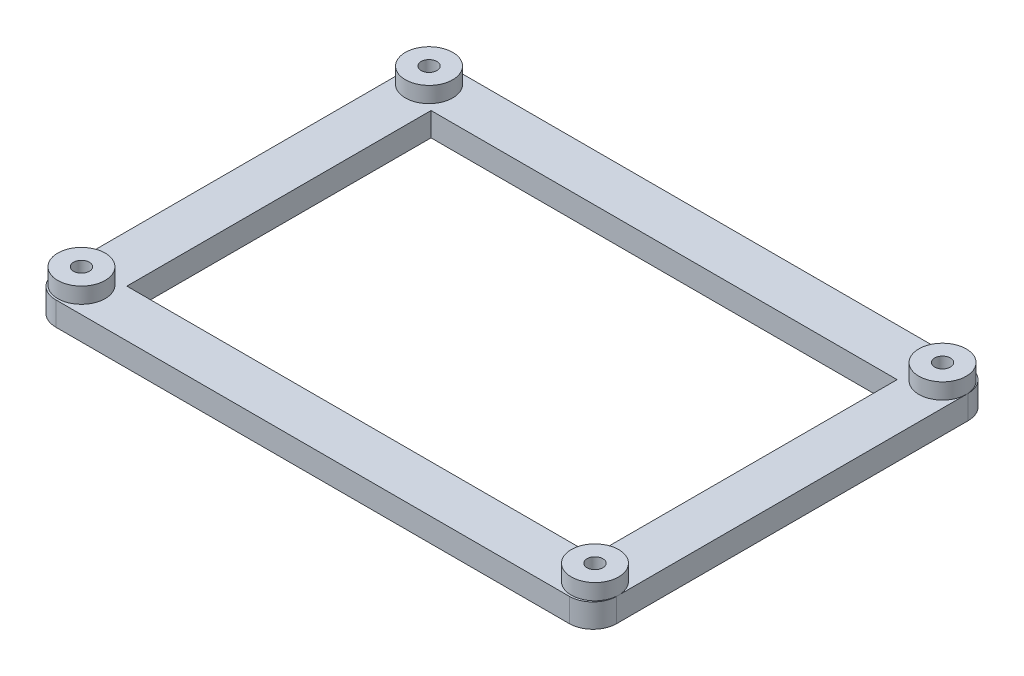
ISO-10303-21;
HEADER;
FILE_DESCRIPTION(('STEP AP214'),'2;1');
FILE_NAME('part.step','',(''),(''),'','','');
FILE_SCHEMA(('AUTOMOTIVE_DESIGN { 1 0 10303 214 1 1 1 1 }'));
ENDSEC;
DATA;
#1=APPLICATION_CONTEXT('core data for automotive mechanical design processes');
#2=APPLICATION_PROTOCOL_DEFINITION('international standard','automotive_design',2000,#1);
#3=PRODUCT_CONTEXT('',#1,'mechanical');
#4=PRODUCT('Part','Part','',(#3));
#5=PRODUCT_RELATED_PRODUCT_CATEGORY('part','',(#4));
#6=PRODUCT_DEFINITION_FORMATION('','',#4);
#7=PRODUCT_DEFINITION_CONTEXT('part definition',#1,'design');
#8=PRODUCT_DEFINITION('design','',#6,#7);
#9=PRODUCT_DEFINITION_SHAPE('','',#8);
#10=(LENGTH_UNIT() NAMED_UNIT(*) SI_UNIT(.MILLI.,.METRE.));
#11=(NAMED_UNIT(*) PLANE_ANGLE_UNIT() SI_UNIT($,.RADIAN.));
#12=(NAMED_UNIT(*) SI_UNIT($,.STERADIAN.) SOLID_ANGLE_UNIT());
#13=UNCERTAINTY_MEASURE_WITH_UNIT(LENGTH_MEASURE(1.E-05),#10,'distance_accuracy_value','');
#14=(GEOMETRIC_REPRESENTATION_CONTEXT(3) GLOBAL_UNCERTAINTY_ASSIGNED_CONTEXT((#13)) GLOBAL_UNIT_ASSIGNED_CONTEXT((#10,
#11,#12)) REPRESENTATION_CONTEXT('',''));
#15=CARTESIAN_POINT('',(0.,0.,0.));
#16=DIRECTION('',(0.,0.,1.));
#17=DIRECTION('',(1.,0.,0.));
#18=AXIS2_PLACEMENT_3D('',#15,#16,#17);
#19=CARTESIAN_POINT('',(0.,3.,0.));
#20=DIRECTION('',(0.,-1.,0.));
#21=DIRECTION('',(0.,0.,-1.));
#22=AXIS2_PLACEMENT_3D('',#19,#20,#21);
#23=PLANE('',#22);
#24=DIRECTION('',(1.,0.,0.));
#25=VECTOR('',#24,1.);
#26=CARTESIAN_POINT('',(-29.5,3.,19.25));
#27=LINE('',#26,#25);
#28=CARTESIAN_POINT('',(-29.5,3.,19.25));
#29=VERTEX_POINT('',#28);
#30=CARTESIAN_POINT('',(29.5,3.,19.25));
#31=VERTEX_POINT('',#30);
#32=EDGE_CURVE('E516',#29,#31,#27,.T.);
#33=ORIENTED_EDGE('',*,*,#32,.F.);
#34=DIRECTION('',(0.,0.,1.));
#35=VECTOR('',#34,1.);
#36=CARTESIAN_POINT('',(-29.5,3.,19.25));
#37=LINE('',#36,#35);
#38=CARTESIAN_POINT('',(-29.5,3.,-19.25));
#39=VERTEX_POINT('',#38);
#40=EDGE_CURVE('E510',#39,#29,#37,.T.);
#41=ORIENTED_EDGE('',*,*,#40,.F.);
#42=DIRECTION('',(-1.,0.,0.));
#43=VECTOR('',#42,1.);
#44=CARTESIAN_POINT('',(-29.5,3.,-19.25));
#45=LINE('',#44,#43);
#46=CARTESIAN_POINT('',(29.5,3.,-19.25));
#47=VERTEX_POINT('',#46);
#48=EDGE_CURVE('E531',#47,#39,#45,.T.);
#49=ORIENTED_EDGE('',*,*,#48,.F.);
#50=DIRECTION('',(0.,0.,-1.));
#51=VECTOR('',#50,1.);
#52=CARTESIAN_POINT('',(29.5,3.,19.25));
#53=LINE('',#52,#51);
#54=EDGE_CURVE('E518',#31,#47,#53,.T.);
#55=ORIENTED_EDGE('',*,*,#54,.F.);
#56=EDGE_LOOP('',(#33,#41,#49,#55));
#57=FACE_BOUND('',#56,.T.);
#58=DIRECTION('',(0.,0.,-1.));
#59=VECTOR('',#58,1.);
#60=CARTESIAN_POINT('',(35.5,3.,25.25));
#61=LINE('',#60,#59);
#62=CARTESIAN_POINT('',(35.5,3.,-22.));
#63=VERTEX_POINT('',#62);
#64=CARTESIAN_POINT('',(35.5,3.,-22.25));
#65=VERTEX_POINT('',#64);
#66=EDGE_CURVE('E175',#63,#65,#61,.T.);
#67=ORIENTED_EDGE('',*,*,#66,.T.);
#68=CARTESIAN_POINT('',(32.5,3.,-22.25));
#69=DIRECTION('',(0.,-1.,0.));
#70=DIRECTION('',(0.,0.,-1.));
#71=AXIS2_PLACEMENT_3D('',#68,#69,#70);
#72=CIRCLE('',#71,3.);
#73=CARTESIAN_POINT('',(32.5,3.,-25.25));
#74=VERTEX_POINT('',#73);
#75=EDGE_CURVE('E197',#65,#74,#72,.F.);
#76=ORIENTED_EDGE('',*,*,#75,.T.);
#77=DIRECTION('',(-1.,0.,0.));
#78=VECTOR('',#77,1.);
#79=CARTESIAN_POINT('',(-35.5,3.,-25.25));
#80=LINE('',#79,#78);
#81=CARTESIAN_POINT('',(-32.5,3.,-25.25));
#82=VERTEX_POINT('',#81);
#83=EDGE_CURVE('E157',#74,#82,#80,.T.);
#84=ORIENTED_EDGE('',*,*,#83,.T.);
#85=CARTESIAN_POINT('',(-32.5,3.,-22.25));
#86=DIRECTION('',(0.,-1.,0.));
#87=DIRECTION('',(0.,0.,-1.));
#88=AXIS2_PLACEMENT_3D('',#85,#86,#87);
#89=CIRCLE('',#88,3.);
#90=CARTESIAN_POINT('',(-35.5,3.,-22.25));
#91=VERTEX_POINT('',#90);
#92=EDGE_CURVE('E146',#82,#91,#89,.F.);
#93=ORIENTED_EDGE('',*,*,#92,.T.);
#94=DIRECTION('',(0.,0.,1.));
#95=VECTOR('',#94,1.);
#96=CARTESIAN_POINT('',(-35.5,3.,25.25));
#97=LINE('',#96,#95);
#98=CARTESIAN_POINT('',(-35.5,3.,-22.));
#99=VERTEX_POINT('',#98);
#100=EDGE_CURVE('E139',#91,#99,#97,.T.);
#101=ORIENTED_EDGE('',*,*,#100,.T.);
#102=CARTESIAN_POINT('',(-32.5,3.,-22.));
#103=DIRECTION('',(0.,1.,0.));
#104=DIRECTION('',(0.,0.,1.));
#105=AXIS2_PLACEMENT_3D('',#102,#103,#104);
#106=CIRCLE('',#105,3.);
#107=EDGE_CURVE('E143',#99,#99,#106,.T.);
#108=ORIENTED_EDGE('',*,*,#107,.F.);
#109=CARTESIAN_POINT('',(-35.5,3.,22.));
#110=VERTEX_POINT('',#109);
#111=EDGE_CURVE('E151',#99,#110,#97,.T.);
#112=ORIENTED_EDGE('',*,*,#111,.T.);
#113=CARTESIAN_POINT('',(-32.5,3.,22.));
#114=DIRECTION('',(0.,1.,0.));
#115=DIRECTION('',(0.,0.,1.));
#116=AXIS2_PLACEMENT_3D('',#113,#114,#115);
#117=CIRCLE('',#116,3.);
#118=EDGE_CURVE('E564',#110,#110,#117,.T.);
#119=ORIENTED_EDGE('',*,*,#118,.F.);
#120=CARTESIAN_POINT('',(-35.5,3.,22.25));
#121=VERTEX_POINT('',#120);
#122=EDGE_CURVE('E153',#110,#121,#97,.T.);
#123=ORIENTED_EDGE('',*,*,#122,.T.);
#124=CARTESIAN_POINT('',(-32.5,3.,22.25));
#125=DIRECTION('',(0.,-1.,0.));
#126=DIRECTION('',(0.,0.,-1.));
#127=AXIS2_PLACEMENT_3D('',#124,#125,#126);
#128=CIRCLE('',#127,3.);
#129=CARTESIAN_POINT('',(-32.5,3.,25.25));
#130=VERTEX_POINT('',#129);
#131=EDGE_CURVE('E59',#121,#130,#128,.F.);
#132=ORIENTED_EDGE('',*,*,#131,.T.);
#133=DIRECTION('',(1.,0.,0.));
#134=VECTOR('',#133,1.);
#135=CARTESIAN_POINT('',(-35.5,3.,25.25));
#136=LINE('',#135,#134);
#137=CARTESIAN_POINT('',(32.5,3.,25.25));
#138=VERTEX_POINT('',#137);
#139=EDGE_CURVE('E150',#130,#138,#136,.T.);
#140=ORIENTED_EDGE('',*,*,#139,.T.);
#141=CARTESIAN_POINT('',(32.5,3.,22.25));
#142=DIRECTION('',(0.,-1.,0.));
#143=DIRECTION('',(0.,0.,-1.));
#144=AXIS2_PLACEMENT_3D('',#141,#142,#143);
#145=CIRCLE('',#144,3.);
#146=CARTESIAN_POINT('',(35.5,3.,22.25));
#147=VERTEX_POINT('',#146);
#148=EDGE_CURVE('E194',#138,#147,#145,.F.);
#149=ORIENTED_EDGE('',*,*,#148,.T.);
#150=CARTESIAN_POINT('',(35.5,3.,22.));
#151=VERTEX_POINT('',#150);
#152=EDGE_CURVE('E222',#147,#151,#61,.T.);
#153=ORIENTED_EDGE('',*,*,#152,.T.);
#154=CARTESIAN_POINT('',(32.5,3.,22.));
#155=DIRECTION('',(0.,1.,0.));
#156=DIRECTION('',(0.,0.,1.));
#157=AXIS2_PLACEMENT_3D('',#154,#155,#156);
#158=CIRCLE('',#157,3.);
#159=EDGE_CURVE('E555',#151,#151,#158,.T.);
#160=ORIENTED_EDGE('',*,*,#159,.F.);
#161=EDGE_CURVE('E224',#151,#63,#61,.T.);
#162=ORIENTED_EDGE('',*,*,#161,.T.);
#163=CARTESIAN_POINT('',(32.5,3.,-22.));
#164=DIRECTION('',(0.,1.,0.));
#165=DIRECTION('',(0.,0.,1.));
#166=AXIS2_PLACEMENT_3D('',#163,#164,#165);
#167=CIRCLE('',#166,3.);
#168=EDGE_CURVE('E231',#63,#63,#167,.T.);
#169=ORIENTED_EDGE('',*,*,#168,.F.);
#170=EDGE_LOOP('',(#67,#76,#84,#93,#101,#108,#112,#119,#123,#132,#140,#149,#153,#160,#162,#169));
#171=FACE_BOUND('',#170,.T.);
#172=ADVANCED_FACE('F39',(#57,#171),#23,.F.);
#173=CARTESIAN_POINT('',(0.,0.,0.));
#174=DIRECTION('',(0.,-1.,0.));
#175=DIRECTION('',(0.,0.,-1.));
#176=AXIS2_PLACEMENT_3D('',#173,#174,#175);
#177=PLANE('',#176);
#178=CARTESIAN_POINT('',(32.5,0.,22.));
#179=DIRECTION('',(0.,1.,0.));
#180=DIRECTION('',(0.,0.,1.));
#181=AXIS2_PLACEMENT_3D('',#178,#179,#180);
#182=CIRCLE('',#181,0.999999999999998);
#183=CARTESIAN_POINT('',(32.5,0.,23.));
#184=VERTEX_POINT('',#183);
#185=EDGE_CURVE('E539',#184,#184,#182,.T.);
#186=ORIENTED_EDGE('',*,*,#185,.T.);
#187=EDGE_LOOP('',(#186));
#188=FACE_BOUND('',#187,.T.);
#189=CARTESIAN_POINT('',(-32.5,0.,-22.));
#190=DIRECTION('',(0.,1.,0.));
#191=DIRECTION('',(0.,0.,1.));
#192=AXIS2_PLACEMENT_3D('',#189,#190,#191);
#193=CIRCLE('',#192,0.999999999999998);
#194=CARTESIAN_POINT('',(-32.5,0.,-21.));
#195=VERTEX_POINT('',#194);
#196=EDGE_CURVE('E504',#195,#195,#193,.T.);
#197=ORIENTED_EDGE('',*,*,#196,.T.);
#198=EDGE_LOOP('',(#197));
#199=FACE_BOUND('',#198,.T.);
#200=DIRECTION('',(-1.,0.,0.));
#201=VECTOR('',#200,1.);
#202=CARTESIAN_POINT('',(-35.5,0.,-25.25));
#203=LINE('',#202,#201);
#204=CARTESIAN_POINT('',(32.5,0.,-25.25));
#205=VERTEX_POINT('',#204);
#206=CARTESIAN_POINT('',(-32.5,0.,-25.25));
#207=VERTEX_POINT('',#206);
#208=EDGE_CURVE('E166',#205,#207,#203,.T.);
#209=ORIENTED_EDGE('',*,*,#208,.F.);
#210=CARTESIAN_POINT('',(32.5,0.,-22.25));
#211=DIRECTION('',(0.,-1.,0.));
#212=DIRECTION('',(0.,0.,-1.));
#213=AXIS2_PLACEMENT_3D('',#210,#211,#212);
#214=CIRCLE('',#213,3.);
#215=CARTESIAN_POINT('',(35.5,0.,-22.25));
#216=VERTEX_POINT('',#215);
#217=EDGE_CURVE('E186',#205,#216,#214,.T.);
#218=ORIENTED_EDGE('',*,*,#217,.T.);
#219=DIRECTION('',(0.,0.,-1.));
#220=VECTOR('',#219,1.);
#221=CARTESIAN_POINT('',(35.5,0.,25.25));
#222=LINE('',#221,#220);
#223=CARTESIAN_POINT('',(35.5,0.,22.25));
#224=VERTEX_POINT('',#223);
#225=EDGE_CURVE('E163',#224,#216,#222,.T.);
#226=ORIENTED_EDGE('',*,*,#225,.F.);
#227=CARTESIAN_POINT('',(32.5,0.,22.25));
#228=DIRECTION('',(0.,-1.,0.));
#229=DIRECTION('',(0.,0.,-1.));
#230=AXIS2_PLACEMENT_3D('',#227,#228,#229);
#231=CIRCLE('',#230,3.);
#232=CARTESIAN_POINT('',(32.5,0.,25.25));
#233=VERTEX_POINT('',#232);
#234=EDGE_CURVE('E182',#224,#233,#231,.T.);
#235=ORIENTED_EDGE('',*,*,#234,.T.);
#236=DIRECTION('',(1.,0.,0.));
#237=VECTOR('',#236,1.);
#238=CARTESIAN_POINT('',(-35.5,0.,25.25));
#239=LINE('',#238,#237);
#240=CARTESIAN_POINT('',(-32.5,0.,25.25));
#241=VERTEX_POINT('',#240);
#242=EDGE_CURVE('E173',#241,#233,#239,.T.);
#243=ORIENTED_EDGE('',*,*,#242,.F.);
#244=CARTESIAN_POINT('',(-32.5,0.,22.25));
#245=DIRECTION('',(0.,-1.,0.));
#246=DIRECTION('',(0.,0.,-1.));
#247=AXIS2_PLACEMENT_3D('',#244,#245,#246);
#248=CIRCLE('',#247,3.);
#249=CARTESIAN_POINT('',(-35.5,0.,22.25));
#250=VERTEX_POINT('',#249);
#251=EDGE_CURVE('E180',#241,#250,#248,.T.);
#252=ORIENTED_EDGE('',*,*,#251,.T.);
#253=DIRECTION('',(0.,0.,1.));
#254=VECTOR('',#253,1.);
#255=CARTESIAN_POINT('',(-35.5,0.,25.25));
#256=LINE('',#255,#254);
#257=CARTESIAN_POINT('',(-35.5,0.,-22.25));
#258=VERTEX_POINT('',#257);
#259=EDGE_CURVE('E170',#258,#250,#256,.T.);
#260=ORIENTED_EDGE('',*,*,#259,.F.);
#261=CARTESIAN_POINT('',(-32.5,0.,-22.25));
#262=DIRECTION('',(0.,-1.,0.));
#263=DIRECTION('',(0.,0.,-1.));
#264=AXIS2_PLACEMENT_3D('',#261,#262,#263);
#265=CIRCLE('',#264,3.);
#266=EDGE_CURVE('E184',#258,#207,#265,.T.);
#267=ORIENTED_EDGE('',*,*,#266,.T.);
#268=EDGE_LOOP('',(#209,#218,#226,#235,#243,#252,#260,#267));
#269=FACE_BOUND('',#268,.T.);
#270=DIRECTION('',(0.,0.,1.));
#271=VECTOR('',#270,1.);
#272=CARTESIAN_POINT('',(-29.5,0.,19.25));
#273=LINE('',#272,#271);
#274=CARTESIAN_POINT('',(-29.5,0.,-19.25));
#275=VERTEX_POINT('',#274);
#276=CARTESIAN_POINT('',(-29.5,0.,19.25));
#277=VERTEX_POINT('',#276);
#278=EDGE_CURVE('E507',#275,#277,#273,.T.);
#279=ORIENTED_EDGE('',*,*,#278,.T.);
#280=DIRECTION('',(1.,0.,0.));
#281=VECTOR('',#280,1.);
#282=CARTESIAN_POINT('',(-29.5,0.,19.25));
#283=LINE('',#282,#281);
#284=CARTESIAN_POINT('',(29.5,0.,19.25));
#285=VERTEX_POINT('',#284);
#286=EDGE_CURVE('E497',#277,#285,#283,.T.);
#287=ORIENTED_EDGE('',*,*,#286,.T.);
#288=DIRECTION('',(0.,0.,-1.));
#289=VECTOR('',#288,1.);
#290=CARTESIAN_POINT('',(29.5,0.,19.25));
#291=LINE('',#290,#289);
#292=CARTESIAN_POINT('',(29.5,0.,-19.25));
#293=VERTEX_POINT('',#292);
#294=EDGE_CURVE('E503',#285,#293,#291,.T.);
#295=ORIENTED_EDGE('',*,*,#294,.T.);
#296=DIRECTION('',(-1.,0.,0.));
#297=VECTOR('',#296,1.);
#298=CARTESIAN_POINT('',(-29.5,0.,-19.25));
#299=LINE('',#298,#297);
#300=EDGE_CURVE('E515',#293,#275,#299,.T.);
#301=ORIENTED_EDGE('',*,*,#300,.T.);
#302=EDGE_LOOP('',(#279,#287,#295,#301));
#303=FACE_BOUND('',#302,.T.);
#304=CARTESIAN_POINT('',(-32.5,0.,22.));
#305=DIRECTION('',(0.,1.,0.));
#306=DIRECTION('',(0.,0.,1.));
#307=AXIS2_PLACEMENT_3D('',#304,#305,#306);
#308=CIRCLE('',#307,0.999999999999998);
#309=CARTESIAN_POINT('',(-32.5,0.,23.));
#310=VERTEX_POINT('',#309);
#311=EDGE_CURVE('E536',#310,#310,#308,.T.);
#312=ORIENTED_EDGE('',*,*,#311,.T.);
#313=EDGE_LOOP('',(#312));
#314=FACE_BOUND('',#313,.T.);
#315=CARTESIAN_POINT('',(32.5,0.,-22.));
#316=DIRECTION('',(0.,1.,0.));
#317=DIRECTION('',(0.,0.,1.));
#318=AXIS2_PLACEMENT_3D('',#315,#316,#317);
#319=CIRCLE('',#318,0.999999999999998);
#320=CARTESIAN_POINT('',(32.5,0.,-21.));
#321=VERTEX_POINT('',#320);
#322=EDGE_CURVE('E542',#321,#321,#319,.T.);
#323=ORIENTED_EDGE('',*,*,#322,.T.);
#324=EDGE_LOOP('',(#323));
#325=FACE_BOUND('',#324,.T.);
#326=ADVANCED_FACE('F209',(#188,#199,#269,#303,#314,#325),#177,.T.);
#327=CARTESIAN_POINT('',(35.5,3.,25.25));
#328=DIRECTION('',(-1.,0.,0.));
#329=DIRECTION('',(0.,0.,1.));
#330=AXIS2_PLACEMENT_3D('',#327,#328,#329);
#331=PLANE('',#330);
#332=ORIENTED_EDGE('',*,*,#225,.T.);
#333=DIRECTION('',(0.,-1.,0.));
#334=VECTOR('',#333,1.);
#335=CARTESIAN_POINT('',(35.5,3.,-22.25));
#336=LINE('',#335,#334);
#337=EDGE_CURVE('E191',#216,#65,#336,.F.);
#338=ORIENTED_EDGE('',*,*,#337,.T.);
#339=ORIENTED_EDGE('',*,*,#66,.F.);
#340=ORIENTED_EDGE('',*,*,#161,.F.);
#341=ORIENTED_EDGE('',*,*,#152,.F.);
#342=DIRECTION('',(0.,-1.,0.));
#343=VECTOR('',#342,1.);
#344=CARTESIAN_POINT('',(35.5,3.,22.25));
#345=LINE('',#344,#343);
#346=EDGE_CURVE('E188',#147,#224,#345,.T.);
#347=ORIENTED_EDGE('',*,*,#346,.T.);
#348=EDGE_LOOP('',(#332,#338,#339,#340,#341,#347));
#349=FACE_BOUND('',#348,.T.);
#350=ADVANCED_FACE('F219',(#349),#331,.F.);
#351=CARTESIAN_POINT('',(-35.5,3.,-25.25));
#352=DIRECTION('',(0.,0.,1.));
#353=DIRECTION('',(1.,0.,0.));
#354=AXIS2_PLACEMENT_3D('',#351,#352,#353);
#355=PLANE('',#354);
#356=ORIENTED_EDGE('',*,*,#83,.F.);
#357=DIRECTION('',(0.,-1.,0.));
#358=VECTOR('',#357,1.);
#359=CARTESIAN_POINT('',(32.5,3.,-25.25));
#360=LINE('',#359,#358);
#361=EDGE_CURVE('E177',#74,#205,#360,.T.);
#362=ORIENTED_EDGE('',*,*,#361,.T.);
#363=ORIENTED_EDGE('',*,*,#208,.T.);
#364=DIRECTION('',(0.,-1.,0.));
#365=VECTOR('',#364,1.);
#366=CARTESIAN_POINT('',(-32.5,3.,-25.25));
#367=LINE('',#366,#365);
#368=EDGE_CURVE('E162',#207,#82,#367,.F.);
#369=ORIENTED_EDGE('',*,*,#368,.T.);
#370=EDGE_LOOP('',(#356,#362,#363,#369));
#371=FACE_BOUND('',#370,.T.);
#372=ADVANCED_FACE('F236',(#371),#355,.F.);
#373=CARTESIAN_POINT('',(-35.5,3.,25.25));
#374=DIRECTION('',(1.,0.,0.));
#375=DIRECTION('',(0.,0.,-1.));
#376=AXIS2_PLACEMENT_3D('',#373,#374,#375);
#377=PLANE('',#376);
#378=ORIENTED_EDGE('',*,*,#100,.F.);
#379=DIRECTION('',(0.,-1.,0.));
#380=VECTOR('',#379,1.);
#381=CARTESIAN_POINT('',(-35.5,3.,-22.25));
#382=LINE('',#381,#380);
#383=EDGE_CURVE('E201',#91,#258,#382,.T.);
#384=ORIENTED_EDGE('',*,*,#383,.T.);
#385=ORIENTED_EDGE('',*,*,#259,.T.);
#386=DIRECTION('',(0.,-1.,0.));
#387=VECTOR('',#386,1.);
#388=CARTESIAN_POINT('',(-35.5,3.,22.25));
#389=LINE('',#388,#387);
#390=EDGE_CURVE('E199',#250,#121,#389,.F.);
#391=ORIENTED_EDGE('',*,*,#390,.T.);
#392=ORIENTED_EDGE('',*,*,#122,.F.);
#393=ORIENTED_EDGE('',*,*,#111,.F.);
#394=EDGE_LOOP('',(#378,#384,#385,#391,#392,#393));
#395=FACE_BOUND('',#394,.T.);
#396=ADVANCED_FACE('F155',(#395),#377,.F.);
#397=CARTESIAN_POINT('',(-35.5,3.,25.25));
#398=DIRECTION('',(0.,0.,-1.));
#399=DIRECTION('',(-1.,0.,0.));
#400=AXIS2_PLACEMENT_3D('',#397,#398,#399);
#401=PLANE('',#400);
#402=ORIENTED_EDGE('',*,*,#242,.T.);
#403=DIRECTION('',(0.,-1.,0.));
#404=VECTOR('',#403,1.);
#405=CARTESIAN_POINT('',(32.5,3.,25.25));
#406=LINE('',#405,#404);
#407=EDGE_CURVE('E11',#233,#138,#406,.F.);
#408=ORIENTED_EDGE('',*,*,#407,.T.);
#409=ORIENTED_EDGE('',*,*,#139,.F.);
#410=DIRECTION('',(0.,-1.,0.));
#411=VECTOR('',#410,1.);
#412=CARTESIAN_POINT('',(-32.5,3.,25.25));
#413=LINE('',#412,#411);
#414=EDGE_CURVE('E47',#130,#241,#413,.T.);
#415=ORIENTED_EDGE('',*,*,#414,.T.);
#416=EDGE_LOOP('',(#402,#408,#409,#415));
#417=FACE_BOUND('',#416,.T.);
#418=ADVANCED_FACE('F205',(#417),#401,.F.);
#419=CARTESIAN_POINT('',(-29.5,3.,19.25));
#420=DIRECTION('',(0.,0.,-1.));
#421=DIRECTION('',(-1.,0.,0.));
#422=AXIS2_PLACEMENT_3D('',#419,#420,#421);
#423=PLANE('',#422);
#424=ORIENTED_EDGE('',*,*,#286,.F.);
#425=DIRECTION('',(0.,-1.,0.));
#426=VECTOR('',#425,1.);
#427=CARTESIAN_POINT('',(-29.5,3.,19.25));
#428=LINE('',#427,#426);
#429=EDGE_CURVE('E499',#29,#277,#428,.T.);
#430=ORIENTED_EDGE('',*,*,#429,.F.);
#431=ORIENTED_EDGE('',*,*,#32,.T.);
#432=DIRECTION('',(0.,-1.,0.));
#433=VECTOR('',#432,1.);
#434=CARTESIAN_POINT('',(29.5,3.,19.25));
#435=LINE('',#434,#433);
#436=EDGE_CURVE('E167',#31,#285,#435,.T.);
#437=ORIENTED_EDGE('',*,*,#436,.T.);
#438=EDGE_LOOP('',(#424,#430,#431,#437));
#439=FACE_BOUND('',#438,.T.);
#440=ADVANCED_FACE('F256',(#439),#423,.T.);
#441=CARTESIAN_POINT('',(29.5,3.,19.25));
#442=DIRECTION('',(-1.,0.,0.));
#443=DIRECTION('',(0.,0.,1.));
#444=AXIS2_PLACEMENT_3D('',#441,#442,#443);
#445=PLANE('',#444);
#446=ORIENTED_EDGE('',*,*,#294,.F.);
#447=ORIENTED_EDGE('',*,*,#436,.F.);
#448=ORIENTED_EDGE('',*,*,#54,.T.);
#449=DIRECTION('',(0.,-1.,0.));
#450=VECTOR('',#449,1.);
#451=CARTESIAN_POINT('',(29.5,3.,-19.25));
#452=LINE('',#451,#450);
#453=EDGE_CURVE('E524',#47,#293,#452,.T.);
#454=ORIENTED_EDGE('',*,*,#453,.T.);
#455=EDGE_LOOP('',(#446,#447,#448,#454));
#456=FACE_BOUND('',#455,.T.);
#457=ADVANCED_FACE('F422',(#456),#445,.T.);
#458=CARTESIAN_POINT('',(-29.5,3.,-19.25));
#459=DIRECTION('',(0.,0.,1.));
#460=DIRECTION('',(1.,0.,0.));
#461=AXIS2_PLACEMENT_3D('',#458,#459,#460);
#462=PLANE('',#461);
#463=ORIENTED_EDGE('',*,*,#300,.F.);
#464=ORIENTED_EDGE('',*,*,#453,.F.);
#465=ORIENTED_EDGE('',*,*,#48,.T.);
#466=DIRECTION('',(0.,-1.,0.));
#467=VECTOR('',#466,1.);
#468=CARTESIAN_POINT('',(-29.5,3.,-19.25));
#469=LINE('',#468,#467);
#470=EDGE_CURVE('E511',#39,#275,#469,.T.);
#471=ORIENTED_EDGE('',*,*,#470,.T.);
#472=EDGE_LOOP('',(#463,#464,#465,#471));
#473=FACE_BOUND('',#472,.T.);
#474=ADVANCED_FACE('F413',(#473),#462,.T.);
#475=CARTESIAN_POINT('',(-29.5,3.,19.25));
#476=DIRECTION('',(1.,0.,0.));
#477=DIRECTION('',(0.,0.,-1.));
#478=AXIS2_PLACEMENT_3D('',#475,#476,#477);
#479=PLANE('',#478);
#480=ORIENTED_EDGE('',*,*,#278,.F.);
#481=ORIENTED_EDGE('',*,*,#470,.F.);
#482=ORIENTED_EDGE('',*,*,#40,.T.);
#483=ORIENTED_EDGE('',*,*,#429,.T.);
#484=EDGE_LOOP('',(#480,#481,#482,#483));
#485=FACE_BOUND('',#484,.T.);
#486=ADVANCED_FACE('F404',(#485),#479,.T.);
#487=CARTESIAN_POINT('',(-32.5,3.,-22.));
#488=DIRECTION('',(0.,-1.,0.));
#489=DIRECTION('',(0.,0.,-1.));
#490=AXIS2_PLACEMENT_3D('',#487,#488,#489);
#491=CYLINDRICAL_SURFACE('',#490,0.999999999999998);
#492=ORIENTED_EDGE('',*,*,#196,.F.);
#493=EDGE_LOOP('',(#492));
#494=FACE_BOUND('',#493,.T.);
#495=CARTESIAN_POINT('',(-32.5,5.,-22.));
#496=DIRECTION('',(0.,1.,0.));
#497=DIRECTION('',(0.,0.,1.));
#498=AXIS2_PLACEMENT_3D('',#495,#496,#497);
#499=CIRCLE('',#498,0.999999999999998);
#500=CARTESIAN_POINT('',(-32.5,5.,-21.));
#501=VERTEX_POINT('',#500);
#502=EDGE_CURVE('E568',#501,#501,#499,.T.);
#503=ORIENTED_EDGE('',*,*,#502,.T.);
#504=EDGE_LOOP('',(#503));
#505=FACE_BOUND('',#504,.T.);
#506=ADVANCED_FACE('F394',(#494,#505),#491,.F.);
#507=CARTESIAN_POINT('',(-32.5,3.,22.));
#508=DIRECTION('',(0.,-1.,0.));
#509=DIRECTION('',(0.,0.,-1.));
#510=AXIS2_PLACEMENT_3D('',#507,#508,#509);
#511=CYLINDRICAL_SURFACE('',#510,0.999999999999998);
#512=ORIENTED_EDGE('',*,*,#311,.F.);
#513=EDGE_LOOP('',(#512));
#514=FACE_BOUND('',#513,.T.);
#515=CARTESIAN_POINT('',(-32.5,5.,22.));
#516=DIRECTION('',(0.,1.,0.));
#517=DIRECTION('',(0.,0.,1.));
#518=AXIS2_PLACEMENT_3D('',#515,#516,#517);
#519=CIRCLE('',#518,0.999999999999998);
#520=CARTESIAN_POINT('',(-32.5,5.,23.));
#521=VERTEX_POINT('',#520);
#522=EDGE_CURVE('E559',#521,#521,#519,.T.);
#523=ORIENTED_EDGE('',*,*,#522,.T.);
#524=EDGE_LOOP('',(#523));
#525=FACE_BOUND('',#524,.T.);
#526=ADVANCED_FACE('F384',(#514,#525),#511,.F.);
#527=CARTESIAN_POINT('',(32.5,3.,22.));
#528=DIRECTION('',(0.,-1.,0.));
#529=DIRECTION('',(0.,0.,-1.));
#530=AXIS2_PLACEMENT_3D('',#527,#528,#529);
#531=CYLINDRICAL_SURFACE('',#530,0.999999999999998);
#532=ORIENTED_EDGE('',*,*,#185,.F.);
#533=EDGE_LOOP('',(#532));
#534=FACE_BOUND('',#533,.T.);
#535=CARTESIAN_POINT('',(32.5,5.,22.));
#536=DIRECTION('',(0.,1.,0.));
#537=DIRECTION('',(0.,0.,1.));
#538=AXIS2_PLACEMENT_3D('',#535,#536,#537);
#539=CIRCLE('',#538,0.999999999999998);
#540=CARTESIAN_POINT('',(32.5,5.,23.));
#541=VERTEX_POINT('',#540);
#542=EDGE_CURVE('E552',#541,#541,#539,.T.);
#543=ORIENTED_EDGE('',*,*,#542,.T.);
#544=EDGE_LOOP('',(#543));
#545=FACE_BOUND('',#544,.T.);
#546=ADVANCED_FACE('F375',(#534,#545),#531,.F.);
#547=CARTESIAN_POINT('',(32.5,3.,-22.));
#548=DIRECTION('',(0.,-1.,0.));
#549=DIRECTION('',(0.,0.,-1.));
#550=AXIS2_PLACEMENT_3D('',#547,#548,#549);
#551=CYLINDRICAL_SURFACE('',#550,0.999999999999998);
#552=ORIENTED_EDGE('',*,*,#322,.F.);
#553=EDGE_LOOP('',(#552));
#554=FACE_BOUND('',#553,.T.);
#555=CARTESIAN_POINT('',(32.5,5.,-22.));
#556=DIRECTION('',(0.,1.,0.));
#557=DIRECTION('',(0.,0.,1.));
#558=AXIS2_PLACEMENT_3D('',#555,#556,#557);
#559=CIRCLE('',#558,0.999999999999998);
#560=CARTESIAN_POINT('',(32.5,5.,-21.));
#561=VERTEX_POINT('',#560);
#562=EDGE_CURVE('E547',#561,#561,#559,.T.);
#563=ORIENTED_EDGE('',*,*,#562,.T.);
#564=EDGE_LOOP('',(#563));
#565=FACE_BOUND('',#564,.T.);
#566=ADVANCED_FACE('F359',(#554,#565),#551,.F.);
#567=CARTESIAN_POINT('',(32.5,5.,-22.));
#568=DIRECTION('',(0.,1.,0.));
#569=DIRECTION('',(0.,0.,1.));
#570=AXIS2_PLACEMENT_3D('',#567,#568,#569);
#571=PLANE('',#570);
#572=CARTESIAN_POINT('',(32.5,5.,-22.));
#573=DIRECTION('',(0.,1.,0.));
#574=DIRECTION('',(0.,0.,1.));
#575=AXIS2_PLACEMENT_3D('',#572,#573,#574);
#576=CIRCLE('',#575,3.);
#577=CARTESIAN_POINT('',(32.5,5.,-19.));
#578=VERTEX_POINT('',#577);
#579=EDGE_CURVE('E545',#578,#578,#576,.T.);
#580=ORIENTED_EDGE('',*,*,#579,.T.);
#581=EDGE_LOOP('',(#580));
#582=FACE_BOUND('',#581,.T.);
#583=ORIENTED_EDGE('',*,*,#562,.F.);
#584=EDGE_LOOP('',(#583));
#585=FACE_BOUND('',#584,.T.);
#586=ADVANCED_FACE('F351',(#582,#585),#571,.T.);
#587=CARTESIAN_POINT('',(32.5,5.,-22.));
#588=DIRECTION('',(0.,-1.,0.));
#589=DIRECTION('',(0.,0.,-1.));
#590=AXIS2_PLACEMENT_3D('',#587,#588,#589);
#591=CYLINDRICAL_SURFACE('',#590,3.);
#592=ORIENTED_EDGE('',*,*,#579,.F.);
#593=EDGE_LOOP('',(#592));
#594=FACE_BOUND('',#593,.T.);
#595=ORIENTED_EDGE('',*,*,#168,.T.);
#596=EDGE_LOOP('',(#595));
#597=FACE_BOUND('',#596,.T.);
#598=ADVANCED_FACE('F342',(#594,#597),#591,.T.);
#599=CARTESIAN_POINT('',(32.5,5.,22.));
#600=DIRECTION('',(0.,1.,0.));
#601=DIRECTION('',(0.,0.,1.));
#602=AXIS2_PLACEMENT_3D('',#599,#600,#601);
#603=PLANE('',#602);
#604=CARTESIAN_POINT('',(32.5,5.,22.));
#605=DIRECTION('',(0.,1.,0.));
#606=DIRECTION('',(0.,0.,1.));
#607=AXIS2_PLACEMENT_3D('',#604,#605,#606);
#608=CIRCLE('',#607,3.);
#609=CARTESIAN_POINT('',(32.5,5.,25.));
#610=VERTEX_POINT('',#609);
#611=EDGE_CURVE('E556',#610,#610,#608,.T.);
#612=ORIENTED_EDGE('',*,*,#611,.T.);
#613=EDGE_LOOP('',(#612));
#614=FACE_BOUND('',#613,.T.);
#615=ORIENTED_EDGE('',*,*,#542,.F.);
#616=EDGE_LOOP('',(#615));
#617=FACE_BOUND('',#616,.T.);
#618=ADVANCED_FACE('F333',(#614,#617),#603,.T.);
#619=CARTESIAN_POINT('',(32.5,5.,22.));
#620=DIRECTION('',(0.,-1.,0.));
#621=DIRECTION('',(0.,0.,-1.));
#622=AXIS2_PLACEMENT_3D('',#619,#620,#621);
#623=CYLINDRICAL_SURFACE('',#622,3.);
#624=ORIENTED_EDGE('',*,*,#611,.F.);
#625=EDGE_LOOP('',(#624));
#626=FACE_BOUND('',#625,.T.);
#627=ORIENTED_EDGE('',*,*,#159,.T.);
#628=EDGE_LOOP('',(#627));
#629=FACE_BOUND('',#628,.T.);
#630=ADVANCED_FACE('F324',(#626,#629),#623,.T.);
#631=CARTESIAN_POINT('',(-32.5,5.,22.));
#632=DIRECTION('',(0.,1.,0.));
#633=DIRECTION('',(0.,0.,1.));
#634=AXIS2_PLACEMENT_3D('',#631,#632,#633);
#635=PLANE('',#634);
#636=CARTESIAN_POINT('',(-32.5,5.,22.));
#637=DIRECTION('',(0.,1.,0.));
#638=DIRECTION('',(0.,0.,1.));
#639=AXIS2_PLACEMENT_3D('',#636,#637,#638);
#640=CIRCLE('',#639,3.);
#641=CARTESIAN_POINT('',(-32.5,5.,25.));
#642=VERTEX_POINT('',#641);
#643=EDGE_CURVE('E565',#642,#642,#640,.T.);
#644=ORIENTED_EDGE('',*,*,#643,.T.);
#645=EDGE_LOOP('',(#644));
#646=FACE_BOUND('',#645,.T.);
#647=ORIENTED_EDGE('',*,*,#522,.F.);
#648=EDGE_LOOP('',(#647));
#649=FACE_BOUND('',#648,.T.);
#650=ADVANCED_FACE('F315',(#646,#649),#635,.T.);
#651=CARTESIAN_POINT('',(-32.5,5.,22.));
#652=DIRECTION('',(0.,-1.,0.));
#653=DIRECTION('',(0.,0.,-1.));
#654=AXIS2_PLACEMENT_3D('',#651,#652,#653);
#655=CYLINDRICAL_SURFACE('',#654,3.);
#656=ORIENTED_EDGE('',*,*,#643,.F.);
#657=EDGE_LOOP('',(#656));
#658=FACE_BOUND('',#657,.T.);
#659=ORIENTED_EDGE('',*,*,#118,.T.);
#660=EDGE_LOOP('',(#659));
#661=FACE_BOUND('',#660,.T.);
#662=ADVANCED_FACE('F306',(#658,#661),#655,.T.);
#663=CARTESIAN_POINT('',(-32.5,5.,-22.));
#664=DIRECTION('',(0.,1.,0.));
#665=DIRECTION('',(0.,0.,1.));
#666=AXIS2_PLACEMENT_3D('',#663,#664,#665);
#667=PLANE('',#666);
#668=CARTESIAN_POINT('',(-32.5,5.,-22.));
#669=DIRECTION('',(0.,1.,0.));
#670=DIRECTION('',(0.,0.,1.));
#671=AXIS2_PLACEMENT_3D('',#668,#669,#670);
#672=CIRCLE('',#671,3.);
#673=CARTESIAN_POINT('',(-32.5,5.,-19.));
#674=VERTEX_POINT('',#673);
#675=EDGE_CURVE('E573',#674,#674,#672,.T.);
#676=ORIENTED_EDGE('',*,*,#675,.T.);
#677=EDGE_LOOP('',(#676));
#678=FACE_BOUND('',#677,.T.);
#679=ORIENTED_EDGE('',*,*,#502,.F.);
#680=EDGE_LOOP('',(#679));
#681=FACE_BOUND('',#680,.T.);
#682=ADVANCED_FACE('F297',(#678,#681),#667,.T.);
#683=CARTESIAN_POINT('',(-32.5,5.,-22.));
#684=DIRECTION('',(0.,-1.,0.));
#685=DIRECTION('',(0.,0.,-1.));
#686=AXIS2_PLACEMENT_3D('',#683,#684,#685);
#687=CYLINDRICAL_SURFACE('',#686,3.);
#688=ORIENTED_EDGE('',*,*,#675,.F.);
#689=EDGE_LOOP('',(#688));
#690=FACE_BOUND('',#689,.T.);
#691=ORIENTED_EDGE('',*,*,#107,.T.);
#692=EDGE_LOOP('',(#691));
#693=FACE_BOUND('',#692,.T.);
#694=ADVANCED_FACE('F269',(#690,#693),#687,.T.);
#695=CARTESIAN_POINT('',(32.5,3.,-22.25));
#696=DIRECTION('',(0.,-1.,0.));
#697=DIRECTION('',(0.,0.,-1.));
#698=AXIS2_PLACEMENT_3D('',#695,#696,#697);
#699=CYLINDRICAL_SURFACE('',#698,3.);
#700=ORIENTED_EDGE('',*,*,#75,.F.);
#701=ORIENTED_EDGE('',*,*,#337,.F.);
#702=ORIENTED_EDGE('',*,*,#217,.F.);
#703=ORIENTED_EDGE('',*,*,#361,.F.);
#704=EDGE_LOOP('',(#700,#701,#702,#703));
#705=FACE_BOUND('',#704,.T.);
#706=ADVANCED_FACE('F234',(#705),#699,.T.);
#707=CARTESIAN_POINT('',(-32.5,3.,-22.25));
#708=DIRECTION('',(0.,-1.,0.));
#709=DIRECTION('',(0.,0.,-1.));
#710=AXIS2_PLACEMENT_3D('',#707,#708,#709);
#711=CYLINDRICAL_SURFACE('',#710,3.);
#712=ORIENTED_EDGE('',*,*,#92,.F.);
#713=ORIENTED_EDGE('',*,*,#368,.F.);
#714=ORIENTED_EDGE('',*,*,#266,.F.);
#715=ORIENTED_EDGE('',*,*,#383,.F.);
#716=EDGE_LOOP('',(#712,#713,#714,#715));
#717=FACE_BOUND('',#716,.T.);
#718=ADVANCED_FACE('F239',(#717),#711,.T.);
#719=CARTESIAN_POINT('',(32.5,3.,22.25));
#720=DIRECTION('',(0.,-1.,0.));
#721=DIRECTION('',(0.,0.,-1.));
#722=AXIS2_PLACEMENT_3D('',#719,#720,#721);
#723=CYLINDRICAL_SURFACE('',#722,3.);
#724=ORIENTED_EDGE('',*,*,#148,.F.);
#725=ORIENTED_EDGE('',*,*,#407,.F.);
#726=ORIENTED_EDGE('',*,*,#234,.F.);
#727=ORIENTED_EDGE('',*,*,#346,.F.);
#728=EDGE_LOOP('',(#724,#725,#726,#727));
#729=FACE_BOUND('',#728,.T.);
#730=ADVANCED_FACE('F216',(#729),#723,.T.);
#731=CARTESIAN_POINT('',(-32.5,3.,22.25));
#732=DIRECTION('',(0.,-1.,0.));
#733=DIRECTION('',(0.,0.,-1.));
#734=AXIS2_PLACEMENT_3D('',#731,#732,#733);
#735=CYLINDRICAL_SURFACE('',#734,3.);
#736=ORIENTED_EDGE('',*,*,#131,.F.);
#737=ORIENTED_EDGE('',*,*,#390,.F.);
#738=ORIENTED_EDGE('',*,*,#251,.F.);
#739=ORIENTED_EDGE('',*,*,#414,.F.);
#740=EDGE_LOOP('',(#736,#737,#738,#739));
#741=FACE_BOUND('',#740,.T.);
#742=ADVANCED_FACE('F41',(#741),#735,.T.);
#743=CLOSED_SHELL('',(#172,#326,#350,#372,#396,#418,#440,#457,#474,#486,#506,#526,#546,#566,
#586,#598,#618,#630,#650,#662,#682,#694,#706,#718,#730,#742));
#744=MANIFOLD_SOLID_BREP('B2',#743);
#745=ADVANCED_BREP_SHAPE_REPRESENTATION('',(#18,#744),#14);
#746=SHAPE_DEFINITION_REPRESENTATION(#9,#745);
ENDSEC;
END-ISO-10303-21;
